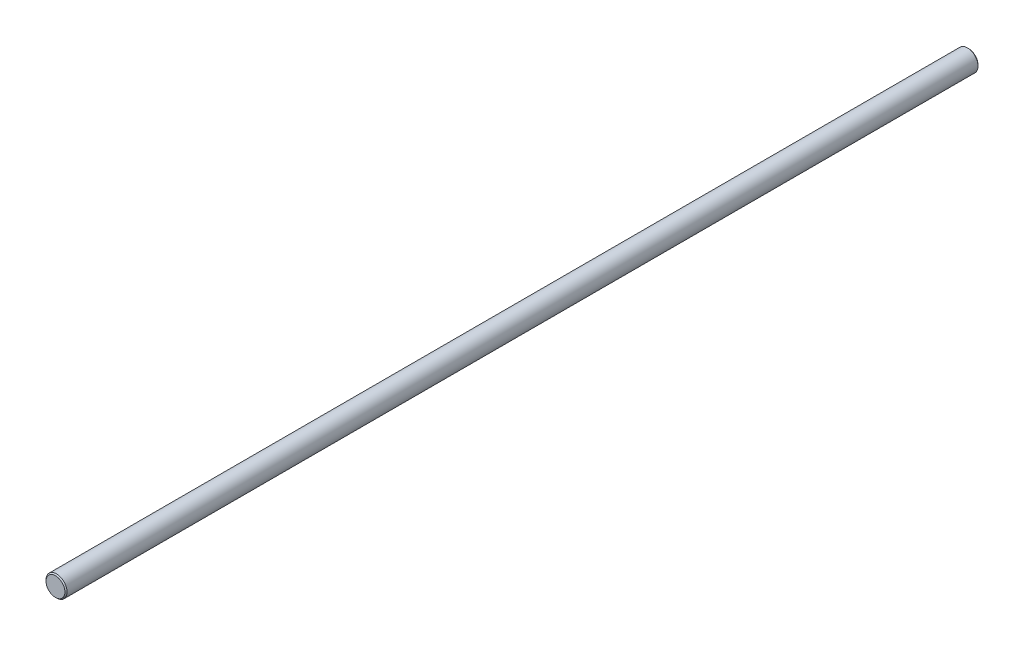
ISO-10303-21;
HEADER;
FILE_DESCRIPTION(('STEP AP214'),'2;1');
FILE_NAME('part.step','',(''),(''),'','','');
FILE_SCHEMA(('AUTOMOTIVE_DESIGN { 1 0 10303 214 1 1 1 1 }'));
ENDSEC;
DATA;
#1=APPLICATION_CONTEXT('core data for automotive mechanical design processes');
#2=APPLICATION_PROTOCOL_DEFINITION('international standard','automotive_design',2000,#1);
#3=PRODUCT_CONTEXT('',#1,'mechanical');
#4=PRODUCT('Part','Part','',(#3));
#5=PRODUCT_RELATED_PRODUCT_CATEGORY('part','',(#4));
#6=PRODUCT_DEFINITION_FORMATION('','',#4);
#7=PRODUCT_DEFINITION_CONTEXT('part definition',#1,'design');
#8=PRODUCT_DEFINITION('design','',#6,#7);
#9=PRODUCT_DEFINITION_SHAPE('','',#8);
#10=(LENGTH_UNIT() NAMED_UNIT(*) SI_UNIT(.MILLI.,.METRE.));
#11=(NAMED_UNIT(*) PLANE_ANGLE_UNIT() SI_UNIT($,.RADIAN.));
#12=(NAMED_UNIT(*) SI_UNIT($,.STERADIAN.) SOLID_ANGLE_UNIT());
#13=UNCERTAINTY_MEASURE_WITH_UNIT(LENGTH_MEASURE(1.E-05),#10,'distance_accuracy_value','');
#14=(GEOMETRIC_REPRESENTATION_CONTEXT(3) GLOBAL_UNCERTAINTY_ASSIGNED_CONTEXT((#13)) GLOBAL_UNIT_ASSIGNED_CONTEXT((#10,
#11,#12)) REPRESENTATION_CONTEXT('',''));
#15=CARTESIAN_POINT('',(0.,0.,0.));
#16=DIRECTION('',(0.,0.,1.));
#17=DIRECTION('',(1.,0.,0.));
#18=AXIS2_PLACEMENT_3D('',#15,#16,#17);
#19=CARTESIAN_POINT('',(0.,0.,217.));
#20=DIRECTION('',(0.,0.,1.));
#21=DIRECTION('',(1.,0.,0.));
#22=AXIS2_PLACEMENT_3D('',#19,#20,#21);
#23=PLANE('',#22);
#24=CARTESIAN_POINT('',(0.,0.,216.999999999985));
#25=DIRECTION('',(0.,0.,-1.));
#26=DIRECTION('',(0.,1.,0.));
#27=AXIS2_PLACEMENT_3D('',#24,#25,#26);
#28=CIRCLE('',#27,4.49999999995043);
#29=CARTESIAN_POINT('',(0.,4.49999999995043,216.999999999985));
#30=VERTEX_POINT('',#29);
#31=EDGE_CURVE('E35',#30,#30,#28,.T.);
#32=ORIENTED_EDGE('',*,*,#31,.F.);
#33=EDGE_LOOP('',(#32));
#34=FACE_BOUND('',#33,.T.);
#35=ADVANCED_FACE('F14',(#34),#23,.T.);
#36=CARTESIAN_POINT('',(0.,0.,-217.));
#37=DIRECTION('',(0.,0.,1.));
#38=DIRECTION('',(1.,0.,0.));
#39=AXIS2_PLACEMENT_3D('',#36,#37,#38);
#40=PLANE('',#39);
#41=CARTESIAN_POINT('',(0.,0.,-216.999999999985));
#42=DIRECTION('',(0.,0.,1.));
#43=DIRECTION('',(0.,-1.,0.));
#44=AXIS2_PLACEMENT_3D('',#41,#42,#43);
#45=CIRCLE('',#44,4.49999999995043);
#46=CARTESIAN_POINT('',(0.,-4.49999999995043,-216.999999999985));
#47=VERTEX_POINT('',#46);
#48=EDGE_CURVE('E26',#47,#47,#45,.T.);
#49=ORIENTED_EDGE('',*,*,#48,.F.);
#50=EDGE_LOOP('',(#49));
#51=FACE_BOUND('',#50,.T.);
#52=ADVANCED_FACE('F44',(#51),#40,.F.);
#53=CARTESIAN_POINT('',(0.,0.,216.500000000053));
#54=DIRECTION('',(0.,0.,-1.));
#55=DIRECTION('',(0.,1.,0.));
#56=AXIS2_PLACEMENT_3D('',#53,#54,#55);
#57=CONICAL_SURFACE('',#56,4.99999999988177,0.785398163397448);
#58=ORIENTED_EDGE('',*,*,#31,.T.);
#59=EDGE_LOOP('',(#58));
#60=FACE_BOUND('',#59,.T.);
#61=CARTESIAN_POINT('',(0.,0.,216.5));
#62=DIRECTION('',(0.,0.,1.));
#63=DIRECTION('',(1.,0.,0.));
#64=AXIS2_PLACEMENT_3D('',#61,#62,#63);
#65=CIRCLE('',#64,5.);
#66=CARTESIAN_POINT('',(5.,0.,216.5));
#67=VERTEX_POINT('',#66);
#68=EDGE_CURVE('E21',#67,#67,#65,.F.);
#69=ORIENTED_EDGE('',*,*,#68,.F.);
#70=EDGE_LOOP('',(#69));
#71=FACE_BOUND('',#70,.T.);
#72=ADVANCED_FACE('F40',(#60,#71),#57,.T.);
#73=CARTESIAN_POINT('',(0.,0.,-216.500000000053));
#74=DIRECTION('',(0.,0.,1.));
#75=DIRECTION('',(0.,-1.,0.));
#76=AXIS2_PLACEMENT_3D('',#73,#74,#75);
#77=CONICAL_SURFACE('',#76,4.99999999988177,0.785398163397448);
#78=ORIENTED_EDGE('',*,*,#48,.T.);
#79=EDGE_LOOP('',(#78));
#80=FACE_BOUND('',#79,.T.);
#81=CARTESIAN_POINT('',(0.,0.,-216.5));
#82=DIRECTION('',(0.,0.,1.));
#83=DIRECTION('',(1.,0.,0.));
#84=AXIS2_PLACEMENT_3D('',#81,#82,#83);
#85=CIRCLE('',#84,5.);
#86=CARTESIAN_POINT('',(5.,0.,-216.5));
#87=VERTEX_POINT('',#86);
#88=EDGE_CURVE('E10',#87,#87,#85,.T.);
#89=ORIENTED_EDGE('',*,*,#88,.F.);
#90=EDGE_LOOP('',(#89));
#91=FACE_BOUND('',#90,.T.);
#92=ADVANCED_FACE('F52',(#80,#91),#77,.T.);
#93=CARTESIAN_POINT('',(0.,0.,0.));
#94=DIRECTION('',(0.,0.,1.));
#95=DIRECTION('',(1.,0.,0.));
#96=AXIS2_PLACEMENT_3D('',#93,#94,#95);
#97=CYLINDRICAL_SURFACE('',#96,5.);
#98=ORIENTED_EDGE('',*,*,#88,.T.);
#99=EDGE_LOOP('',(#98));
#100=FACE_BOUND('',#99,.T.);
#101=ORIENTED_EDGE('',*,*,#68,.T.);
#102=EDGE_LOOP('',(#101));
#103=FACE_BOUND('',#102,.T.);
#104=ADVANCED_FACE('F50',(#100,#103),#97,.T.);
#105=CLOSED_SHELL('',(#35,#52,#72,#92,#104));
#106=MANIFOLD_SOLID_BREP('B1',#105);
#107=ADVANCED_BREP_SHAPE_REPRESENTATION('',(#18,#106),#14);
#108=SHAPE_DEFINITION_REPRESENTATION(#9,#107);
ENDSEC;
END-ISO-10303-21;
